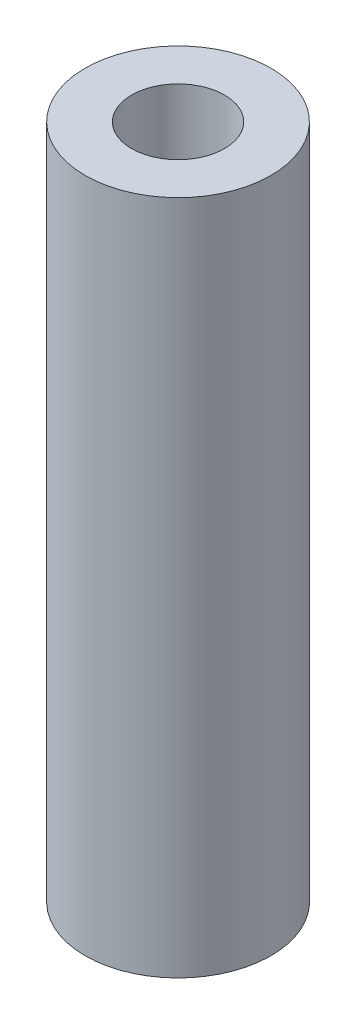
ISO-10303-21;
HEADER;
FILE_DESCRIPTION(('STEP AP214'),'2;1');
FILE_NAME('part.step','',(''),(''),'','','');
FILE_SCHEMA(('AUTOMOTIVE_DESIGN { 1 0 10303 214 1 1 1 1 }'));
ENDSEC;
DATA;
#1=APPLICATION_CONTEXT('core data for automotive mechanical design processes');
#2=APPLICATION_PROTOCOL_DEFINITION('international standard','automotive_design',2000,#1);
#3=PRODUCT_CONTEXT('',#1,'mechanical');
#4=PRODUCT('Part','Part','',(#3));
#5=PRODUCT_RELATED_PRODUCT_CATEGORY('part','',(#4));
#6=PRODUCT_DEFINITION_FORMATION('','',#4);
#7=PRODUCT_DEFINITION_CONTEXT('part definition',#1,'design');
#8=PRODUCT_DEFINITION('design','',#6,#7);
#9=PRODUCT_DEFINITION_SHAPE('','',#8);
#10=(LENGTH_UNIT() NAMED_UNIT(*) SI_UNIT(.MILLI.,.METRE.));
#11=(NAMED_UNIT(*) PLANE_ANGLE_UNIT() SI_UNIT($,.RADIAN.));
#12=(NAMED_UNIT(*) SI_UNIT($,.STERADIAN.) SOLID_ANGLE_UNIT());
#13=UNCERTAINTY_MEASURE_WITH_UNIT(LENGTH_MEASURE(1.E-05),#10,'distance_accuracy_value','');
#14=(GEOMETRIC_REPRESENTATION_CONTEXT(3) GLOBAL_UNCERTAINTY_ASSIGNED_CONTEXT((#13)) GLOBAL_UNIT_ASSIGNED_CONTEXT((#10,
#11,#12)) REPRESENTATION_CONTEXT('',''));
#15=CARTESIAN_POINT('',(0.,0.,0.));
#16=DIRECTION('',(0.,0.,1.));
#17=DIRECTION('',(1.,0.,0.));
#18=AXIS2_PLACEMENT_3D('',#15,#16,#17);
#19=CARTESIAN_POINT('',(0.,40.,0.));
#20=DIRECTION('',(0.,1.,0.));
#21=DIRECTION('',(0.,0.,1.));
#22=AXIS2_PLACEMENT_3D('',#19,#20,#21);
#23=PLANE('',#22);
#24=CARTESIAN_POINT('',(0.,40.,0.));
#25=DIRECTION('',(0.,1.,0.));
#26=DIRECTION('',(0.,0.,1.));
#27=AXIS2_PLACEMENT_3D('',#24,#25,#26);
#28=CIRCLE('',#27,11.);
#29=CARTESIAN_POINT('',(0.,40.,11.));
#30=VERTEX_POINT('',#29);
#31=EDGE_CURVE('E10',#30,#30,#28,.T.);
#32=ORIENTED_EDGE('',*,*,#31,.T.);
#33=EDGE_LOOP('',(#32));
#34=FACE_BOUND('',#33,.T.);
#35=CARTESIAN_POINT('',(0.,40.,0.));
#36=DIRECTION('',(0.,1.,0.));
#37=DIRECTION('',(0.,0.,1.));
#38=AXIS2_PLACEMENT_3D('',#35,#36,#37);
#39=CIRCLE('',#38,5.5);
#40=CARTESIAN_POINT('',(0.,40.,5.5));
#41=VERTEX_POINT('',#40);
#42=EDGE_CURVE('E46',#41,#41,#39,.T.);
#43=ORIENTED_EDGE('',*,*,#42,.F.);
#44=EDGE_LOOP('',(#43));
#45=FACE_BOUND('',#44,.T.);
#46=ADVANCED_FACE('F32',(#34,#45),#23,.T.);
#47=CARTESIAN_POINT('',(0.,-40.,0.));
#48=DIRECTION('',(0.,1.,0.));
#49=DIRECTION('',(0.,0.,1.));
#50=AXIS2_PLACEMENT_3D('',#47,#48,#49);
#51=PLANE('',#50);
#52=CARTESIAN_POINT('',(0.,-40.,0.));
#53=DIRECTION('',(0.,1.,0.));
#54=DIRECTION('',(0.,0.,1.));
#55=AXIS2_PLACEMENT_3D('',#52,#53,#54);
#56=CIRCLE('',#55,11.);
#57=CARTESIAN_POINT('',(0.,-40.,11.));
#58=VERTEX_POINT('',#57);
#59=EDGE_CURVE('E36',#58,#58,#56,.T.);
#60=ORIENTED_EDGE('',*,*,#59,.F.);
#61=EDGE_LOOP('',(#60));
#62=FACE_BOUND('',#61,.T.);
#63=CARTESIAN_POINT('',(0.,-40.,0.));
#64=DIRECTION('',(0.,1.,0.));
#65=DIRECTION('',(0.,0.,1.));
#66=AXIS2_PLACEMENT_3D('',#63,#64,#65);
#67=CIRCLE('',#66,5.5);
#68=CARTESIAN_POINT('',(0.,-40.,5.5));
#69=VERTEX_POINT('',#68);
#70=EDGE_CURVE('E48',#69,#69,#67,.T.);
#71=ORIENTED_EDGE('',*,*,#70,.T.);
#72=EDGE_LOOP('',(#71));
#73=FACE_BOUND('',#72,.T.);
#74=ADVANCED_FACE('F61',(#62,#73),#51,.F.);
#75=CARTESIAN_POINT('',(0.,40.,0.));
#76=DIRECTION('',(0.,-1.,0.));
#77=DIRECTION('',(0.,0.,-1.));
#78=AXIS2_PLACEMENT_3D('',#75,#76,#77);
#79=CYLINDRICAL_SURFACE('',#78,11.);
#80=ORIENTED_EDGE('',*,*,#31,.F.);
#81=EDGE_LOOP('',(#80));
#82=FACE_BOUND('',#81,.T.);
#83=ORIENTED_EDGE('',*,*,#59,.T.);
#84=EDGE_LOOP('',(#83));
#85=FACE_BOUND('',#84,.T.);
#86=ADVANCED_FACE('F34',(#82,#85),#79,.T.);
#87=CARTESIAN_POINT('',(0.,40.,0.));
#88=DIRECTION('',(0.,-1.,0.));
#89=DIRECTION('',(0.,0.,-1.));
#90=AXIS2_PLACEMENT_3D('',#87,#88,#89);
#91=CYLINDRICAL_SURFACE('',#90,5.5);
#92=ORIENTED_EDGE('',*,*,#42,.T.);
#93=EDGE_LOOP('',(#92));
#94=FACE_BOUND('',#93,.T.);
#95=ORIENTED_EDGE('',*,*,#70,.F.);
#96=EDGE_LOOP('',(#95));
#97=FACE_BOUND('',#96,.T.);
#98=ADVANCED_FACE('F57',(#94,#97),#91,.F.);
#99=CLOSED_SHELL('',(#46,#74,#86,#98));
#100=MANIFOLD_SOLID_BREP('B2',#99);
#101=ADVANCED_BREP_SHAPE_REPRESENTATION('',(#18,#100),#14);
#102=SHAPE_DEFINITION_REPRESENTATION(#9,#101);
ENDSEC;
END-ISO-10303-21;
